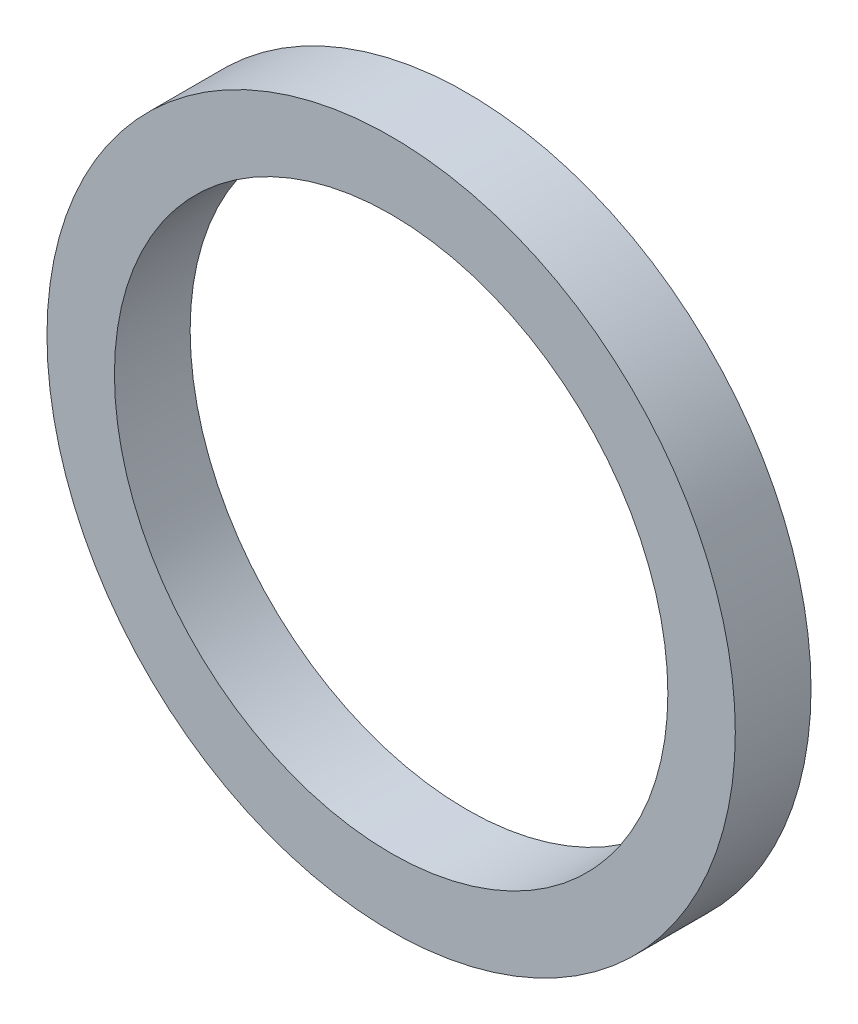
ISO-10303-21;
HEADER;
FILE_DESCRIPTION(('STEP AP214'),'2;1');
FILE_NAME('part.step','',(''),(''),'','','');
FILE_SCHEMA(('AUTOMOTIVE_DESIGN { 1 0 10303 214 1 1 1 1 }'));
ENDSEC;
DATA;
#1=APPLICATION_CONTEXT('core data for automotive mechanical design processes');
#2=APPLICATION_PROTOCOL_DEFINITION('international standard','automotive_design',2000,#1);
#3=PRODUCT_CONTEXT('',#1,'mechanical');
#4=PRODUCT('Part','Part','',(#3));
#5=PRODUCT_RELATED_PRODUCT_CATEGORY('part','',(#4));
#6=PRODUCT_DEFINITION_FORMATION('','',#4);
#7=PRODUCT_DEFINITION_CONTEXT('part definition',#1,'design');
#8=PRODUCT_DEFINITION('design','',#6,#7);
#9=PRODUCT_DEFINITION_SHAPE('','',#8);
#10=(LENGTH_UNIT() NAMED_UNIT(*) SI_UNIT(.MILLI.,.METRE.));
#11=(NAMED_UNIT(*) PLANE_ANGLE_UNIT() SI_UNIT($,.RADIAN.));
#12=(NAMED_UNIT(*) SI_UNIT($,.STERADIAN.) SOLID_ANGLE_UNIT());
#13=UNCERTAINTY_MEASURE_WITH_UNIT(LENGTH_MEASURE(1.E-05),#10,'distance_accuracy_value','');
#14=(GEOMETRIC_REPRESENTATION_CONTEXT(3) GLOBAL_UNCERTAINTY_ASSIGNED_CONTEXT((#13)) GLOBAL_UNIT_ASSIGNED_CONTEXT((#10,
#11,#12)) REPRESENTATION_CONTEXT('',''));
#15=CARTESIAN_POINT('',(0.,0.,0.));
#16=DIRECTION('',(0.,0.,1.));
#17=DIRECTION('',(1.,0.,0.));
#18=AXIS2_PLACEMENT_3D('',#15,#16,#17);
#19=CARTESIAN_POINT('',(0.,0.,5.5));
#20=DIRECTION('',(0.,0.,1.));
#21=DIRECTION('',(1.,0.,0.));
#22=AXIS2_PLACEMENT_3D('',#19,#20,#21);
#23=PLANE('',#22);
#24=CARTESIAN_POINT('',(0.,0.,5.5));
#25=DIRECTION('',(0.,0.,1.));
#26=DIRECTION('',(1.,0.,0.));
#27=AXIS2_PLACEMENT_3D('',#24,#25,#26);
#28=CIRCLE('',#27,25.);
#29=CARTESIAN_POINT('',(25.,0.,5.5));
#30=VERTEX_POINT('',#29);
#31=EDGE_CURVE('E10',#30,#30,#28,.T.);
#32=ORIENTED_EDGE('',*,*,#31,.T.);
#33=EDGE_LOOP('',(#32));
#34=FACE_BOUND('',#33,.T.);
#35=CARTESIAN_POINT('',(0.,0.,5.5));
#36=DIRECTION('',(0.,0.,1.));
#37=DIRECTION('',(1.,0.,0.));
#38=AXIS2_PLACEMENT_3D('',#35,#36,#37);
#39=CIRCLE('',#38,20.1);
#40=CARTESIAN_POINT('',(20.1,0.,5.5));
#41=VERTEX_POINT('',#40);
#42=EDGE_CURVE('E41',#41,#41,#39,.T.);
#43=ORIENTED_EDGE('',*,*,#42,.F.);
#44=EDGE_LOOP('',(#43));
#45=FACE_BOUND('',#44,.T.);
#46=ADVANCED_FACE('F30',(#34,#45),#23,.T.);
#47=CARTESIAN_POINT('',(0.,0.,0.));
#48=DIRECTION('',(0.,0.,1.));
#49=DIRECTION('',(1.,0.,0.));
#50=AXIS2_PLACEMENT_3D('',#47,#48,#49);
#51=PLANE('',#50);
#52=CARTESIAN_POINT('',(0.,0.,0.));
#53=DIRECTION('',(0.,0.,1.));
#54=DIRECTION('',(1.,0.,0.));
#55=AXIS2_PLACEMENT_3D('',#52,#53,#54);
#56=CIRCLE('',#55,25.);
#57=CARTESIAN_POINT('',(25.,0.,0.));
#58=VERTEX_POINT('',#57);
#59=EDGE_CURVE('E34',#58,#58,#56,.T.);
#60=ORIENTED_EDGE('',*,*,#59,.F.);
#61=EDGE_LOOP('',(#60));
#62=FACE_BOUND('',#61,.T.);
#63=CARTESIAN_POINT('',(0.,0.,0.));
#64=DIRECTION('',(0.,0.,1.));
#65=DIRECTION('',(1.,0.,0.));
#66=AXIS2_PLACEMENT_3D('',#63,#64,#65);
#67=CIRCLE('',#66,20.1);
#68=CARTESIAN_POINT('',(20.1,0.,0.));
#69=VERTEX_POINT('',#68);
#70=EDGE_CURVE('E43',#69,#69,#67,.T.);
#71=ORIENTED_EDGE('',*,*,#70,.T.);
#72=EDGE_LOOP('',(#71));
#73=FACE_BOUND('',#72,.T.);
#74=ADVANCED_FACE('F53',(#62,#73),#51,.F.);
#75=CARTESIAN_POINT('',(0.,0.,5.5));
#76=DIRECTION('',(0.,0.,-1.));
#77=DIRECTION('',(-1.,0.,0.));
#78=AXIS2_PLACEMENT_3D('',#75,#76,#77);
#79=CYLINDRICAL_SURFACE('',#78,25.);
#80=ORIENTED_EDGE('',*,*,#31,.F.);
#81=EDGE_LOOP('',(#80));
#82=FACE_BOUND('',#81,.T.);
#83=ORIENTED_EDGE('',*,*,#59,.T.);
#84=EDGE_LOOP('',(#83));
#85=FACE_BOUND('',#84,.T.);
#86=ADVANCED_FACE('F32',(#82,#85),#79,.T.);
#87=CARTESIAN_POINT('',(0.,0.,5.5));
#88=DIRECTION('',(0.,0.,-1.));
#89=DIRECTION('',(-1.,0.,0.));
#90=AXIS2_PLACEMENT_3D('',#87,#88,#89);
#91=CYLINDRICAL_SURFACE('',#90,20.1);
#92=ORIENTED_EDGE('',*,*,#42,.T.);
#93=EDGE_LOOP('',(#92));
#94=FACE_BOUND('',#93,.T.);
#95=ORIENTED_EDGE('',*,*,#70,.F.);
#96=EDGE_LOOP('',(#95));
#97=FACE_BOUND('',#96,.T.);
#98=ADVANCED_FACE('F49',(#94,#97),#91,.F.);
#99=CLOSED_SHELL('',(#46,#74,#86,#98));
#100=MANIFOLD_SOLID_BREP('B2',#99);
#101=ADVANCED_BREP_SHAPE_REPRESENTATION('',(#18,#100),#14);
#102=SHAPE_DEFINITION_REPRESENTATION(#9,#101);
ENDSEC;
END-ISO-10303-21;
